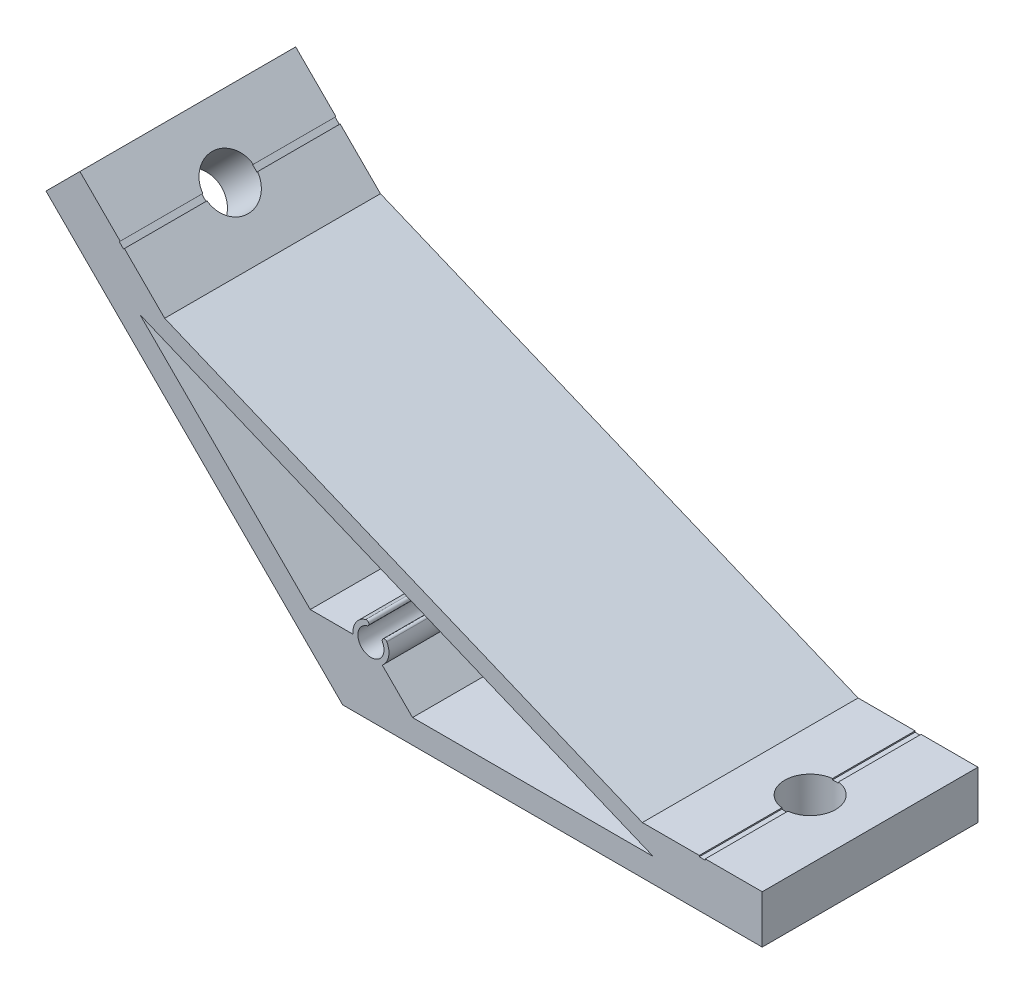
ISO-10303-21;
HEADER;
FILE_DESCRIPTION(('STEP AP214'),'2;1');
FILE_NAME('part.step','',(''),(''),'','','');
FILE_SCHEMA(('AUTOMOTIVE_DESIGN { 1 0 10303 214 1 1 1 1 }'));
ENDSEC;
DATA;
#1=APPLICATION_CONTEXT('core data for automotive mechanical design processes');
#2=APPLICATION_PROTOCOL_DEFINITION('international standard','automotive_design',2000,#1);
#3=PRODUCT_CONTEXT('',#1,'mechanical');
#4=PRODUCT('Part','Part','',(#3));
#5=PRODUCT_RELATED_PRODUCT_CATEGORY('part','',(#4));
#6=PRODUCT_DEFINITION_FORMATION('','',#4);
#7=PRODUCT_DEFINITION_CONTEXT('part definition',#1,'design');
#8=PRODUCT_DEFINITION('design','',#6,#7);
#9=PRODUCT_DEFINITION_SHAPE('','',#8);
#10=(LENGTH_UNIT() NAMED_UNIT(*) SI_UNIT(.MILLI.,.METRE.));
#11=(NAMED_UNIT(*) PLANE_ANGLE_UNIT() SI_UNIT($,.RADIAN.));
#12=(NAMED_UNIT(*) SI_UNIT($,.STERADIAN.) SOLID_ANGLE_UNIT());
#13=UNCERTAINTY_MEASURE_WITH_UNIT(LENGTH_MEASURE(1.E-05),#10,'distance_accuracy_value','');
#14=(GEOMETRIC_REPRESENTATION_CONTEXT(3) GLOBAL_UNCERTAINTY_ASSIGNED_CONTEXT((#13)) GLOBAL_UNIT_ASSIGNED_CONTEXT((#10,
#11,#12)) REPRESENTATION_CONTEXT('',''));
#15=CARTESIAN_POINT('',(0.,0.,0.));
#16=DIRECTION('',(0.,0.,1.));
#17=DIRECTION('',(1.,0.,0.));
#18=AXIS2_PLACEMENT_3D('',#15,#16,#17);
#19=CARTESIAN_POINT('',(-43.8406204335662,55.1543289325505,36.));
#20=DIRECTION('',(-0.707106781186544,-0.707106781186551,0.));
#21=DIRECTION('',(0.707106781186551,-0.707106781186544,0.));
#22=AXIS2_PLACEMENT_3D('',#19,#20,#21);
#23=PLANE('',#22);
#24=DIRECTION('',(-0.707106781186551,0.707106781186544,0.));
#25=VECTOR('',#24,1.);
#26=CARTESIAN_POINT('',(-43.8406204335662,55.1543289325505,36.));
#27=LINE('',#26,#25);
#28=CARTESIAN_POINT('',(-37.123106012294,48.4368145112783,36.));
#29=VERTEX_POINT('',#28);
#30=CARTESIAN_POINT('',(-43.8406204335662,55.1543289325505,36.));
#31=VERTEX_POINT('',#30);
#32=EDGE_CURVE('E406',#29,#31,#27,.T.);
#33=ORIENTED_EDGE('',*,*,#32,.F.);
#34=DIRECTION('',(0.,0.,1.));
#35=VECTOR('',#34,1.);
#36=CARTESIAN_POINT('',(-37.123106012294,48.4368145112783,36.));
#37=LINE('',#36,#35);
#38=CARTESIAN_POINT('',(-37.123106012294,48.4368145112783,22.2204857540335));
#39=VERTEX_POINT('',#38);
#40=EDGE_CURVE('E488',#39,#29,#37,.T.);
#41=ORIENTED_EDGE('',*,*,#40,.F.);
#42=CARTESIAN_POINT('',(-36.7695526217007,48.083261120685,18.));
#43=DIRECTION('',(-0.707106781186544,-0.707106781186551,0.));
#44=DIRECTION('',(0.707106781186551,-0.707106781186544,0.));
#45=AXIS2_PLACEMENT_3D('',#42,#43,#44);
#46=CIRCLE('',#45,4.25);
#47=CARTESIAN_POINT('',(-37.123106012294,48.4368145112783,13.7795142459665));
#48=VERTEX_POINT('',#47);
#49=EDGE_CURVE('E451',#48,#39,#46,.F.);
#50=ORIENTED_EDGE('',*,*,#49,.F.);
#51=CARTESIAN_POINT('',(-37.123106012294,48.4368145112783,0.));
#52=VERTEX_POINT('',#51);
#53=EDGE_CURVE('E264',#52,#48,#37,.T.);
#54=ORIENTED_EDGE('',*,*,#53,.F.);
#55=DIRECTION('',(-0.707106781186551,0.707106781186544,0.));
#56=VECTOR('',#55,1.);
#57=CARTESIAN_POINT('',(-43.8406204335662,55.1543289325505,0.));
#58=LINE('',#57,#56);
#59=CARTESIAN_POINT('',(-43.8406204335662,55.1543289325505,0.));
#60=VERTEX_POINT('',#59);
#61=EDGE_CURVE('E423',#52,#60,#58,.T.);
#62=ORIENTED_EDGE('',*,*,#61,.T.);
#63=DIRECTION('',(0.,0.,-1.));
#64=VECTOR('',#63,1.);
#65=CARTESIAN_POINT('',(-43.8406204335662,55.1543289325505,36.));
#66=LINE('',#65,#64);
#67=EDGE_CURVE('E430',#31,#60,#66,.T.);
#68=ORIENTED_EDGE('',*,*,#67,.F.);
#69=EDGE_LOOP('',(#33,#41,#50,#54,#62,#68));
#70=FACE_BOUND('',#69,.T.);
#71=ADVANCED_FACE('F35',(#70),#23,.F.);
#72=CARTESIAN_POINT('',(50.,8.,36.));
#73=DIRECTION('',(0.,-1.,0.));
#74=DIRECTION('',(0.,0.,-1.));
#75=AXIS2_PLACEMENT_3D('',#72,#73,#74);
#76=PLANE('',#75);
#77=DIRECTION('',(-1.,0.,0.));
#78=VECTOR('',#77,1.);
#79=CARTESIAN_POINT('',(50.,8.,36.));
#80=LINE('',#79,#78);
#81=CARTESIAN_POINT('',(59.5,8.,36.));
#82=VERTEX_POINT('',#81);
#83=CARTESIAN_POINT('',(50.,8.,36.));
#84=VERTEX_POINT('',#83);
#85=EDGE_CURVE('E400',#82,#84,#80,.T.);
#86=ORIENTED_EDGE('',*,*,#85,.F.);
#87=DIRECTION('',(0.,0.,1.));
#88=VECTOR('',#87,1.);
#89=CARTESIAN_POINT('',(59.5,8.,36.));
#90=LINE('',#89,#88);
#91=CARTESIAN_POINT('',(59.5,8.,22.2204857540335));
#92=VERTEX_POINT('',#91);
#93=EDGE_CURVE('E295',#92,#82,#90,.T.);
#94=ORIENTED_EDGE('',*,*,#93,.F.);
#95=CARTESIAN_POINT('',(60.,8.,18.));
#96=DIRECTION('',(0.,1.,0.));
#97=DIRECTION('',(0.,0.,1.));
#98=AXIS2_PLACEMENT_3D('',#95,#96,#97);
#99=CIRCLE('',#98,4.25000000000001);
#100=CARTESIAN_POINT('',(59.5,8.,13.7795142459665));
#101=VERTEX_POINT('',#100);
#102=EDGE_CURVE('E315',#101,#92,#99,.T.);
#103=ORIENTED_EDGE('',*,*,#102,.F.);
#104=CARTESIAN_POINT('',(59.5,8.,0.));
#105=VERTEX_POINT('',#104);
#106=EDGE_CURVE('E292',#105,#101,#90,.T.);
#107=ORIENTED_EDGE('',*,*,#106,.F.);
#108=DIRECTION('',(-1.,0.,0.));
#109=VECTOR('',#108,1.);
#110=CARTESIAN_POINT('',(50.,8.,0.));
#111=LINE('',#110,#109);
#112=CARTESIAN_POINT('',(50.,8.,0.));
#113=VERTEX_POINT('',#112);
#114=EDGE_CURVE('E417',#105,#113,#111,.T.);
#115=ORIENTED_EDGE('',*,*,#114,.T.);
#116=DIRECTION('',(0.,0.,-1.));
#117=VECTOR('',#116,1.);
#118=CARTESIAN_POINT('',(50.,8.,36.));
#119=LINE('',#118,#117);
#120=EDGE_CURVE('E436',#84,#113,#119,.T.);
#121=ORIENTED_EDGE('',*,*,#120,.F.);
#122=EDGE_LOOP('',(#86,#94,#103,#107,#115,#121));
#123=FACE_BOUND('',#122,.T.);
#124=ADVANCED_FACE('F526',(#123),#76,.F.);
#125=CARTESIAN_POINT('',(0.,0.,36.));
#126=DIRECTION('',(0.,0.,-1.));
#127=DIRECTION('',(-1.,0.,0.));
#128=AXIS2_PLACEMENT_3D('',#125,#126,#127);
#129=PLANE('',#128);
#130=DIRECTION('',(0.707106781186551,-0.707106781186544,0.));
#131=VECTOR('',#130,1.);
#132=CARTESIAN_POINT('',(-37.2645273685313,48.295393155041,36.));
#133=LINE('',#132,#131);
#134=CARTESIAN_POINT('',(-37.2645273685313,48.295393155041,36.));
#135=VERTEX_POINT('',#134);
#136=CARTESIAN_POINT('',(-36.5574205873448,47.5882863738545,36.));
#137=VERTEX_POINT('',#136);
#138=EDGE_CURVE('E257',#135,#137,#133,.T.);
#139=ORIENTED_EDGE('',*,*,#138,.F.);
#140=DIRECTION('',(0.707106781186544,0.707106781186551,0.));
#141=VECTOR('',#140,1.);
#142=CARTESIAN_POINT('',(-37.2645273685313,48.295393155041,36.));
#143=LINE('',#142,#141);
#144=EDGE_CURVE('E483',#135,#29,#143,.T.);
#145=ORIENTED_EDGE('',*,*,#144,.T.);
#146=ORIENTED_EDGE('',*,*,#32,.T.);
#147=DIRECTION('',(-0.707106781186544,-0.707106781186551,0.));
#148=VECTOR('',#147,1.);
#149=CARTESIAN_POINT('',(-49.4974746830586,49.4974746830581,36.));
#150=LINE('',#149,#148);
#151=CARTESIAN_POINT('',(-49.4974746830586,49.4974746830581,36.));
#152=VERTEX_POINT('',#151);
#153=EDGE_CURVE('E408',#31,#152,#150,.T.);
#154=ORIENTED_EDGE('',*,*,#153,.T.);
#155=DIRECTION('',(0.707106781186551,-0.707106781186544,0.));
#156=VECTOR('',#155,1.);
#157=CARTESIAN_POINT('',(0.,0.,36.));
#158=LINE('',#157,#156);
#159=CARTESIAN_POINT('',(0.,0.,36.));
#160=VERTEX_POINT('',#159);
#161=EDGE_CURVE('E392',#152,#160,#158,.T.);
#162=ORIENTED_EDGE('',*,*,#161,.T.);
#163=DIRECTION('',(1.,0.,0.));
#164=VECTOR('',#163,1.);
#165=CARTESIAN_POINT('',(0.,0.,36.));
#166=LINE('',#165,#164);
#167=CARTESIAN_POINT('',(70.,0.,36.));
#168=VERTEX_POINT('',#167);
#169=EDGE_CURVE('E395',#160,#168,#166,.T.);
#170=ORIENTED_EDGE('',*,*,#169,.T.);
#171=DIRECTION('',(0.,1.,0.));
#172=VECTOR('',#171,1.);
#173=CARTESIAN_POINT('',(70.,8.,36.));
#174=LINE('',#173,#172);
#175=CARTESIAN_POINT('',(70.,8.,36.));
#176=VERTEX_POINT('',#175);
#177=EDGE_CURVE('E398',#168,#176,#174,.T.);
#178=ORIENTED_EDGE('',*,*,#177,.T.);
#179=CARTESIAN_POINT('',(60.5,8.,36.));
#180=VERTEX_POINT('',#179);
#181=EDGE_CURVE('E401',#176,#180,#80,.T.);
#182=ORIENTED_EDGE('',*,*,#181,.T.);
#183=DIRECTION('',(0.,1.,0.));
#184=VECTOR('',#183,1.);
#185=CARTESIAN_POINT('',(60.5,7.8,36.));
#186=LINE('',#185,#184);
#187=CARTESIAN_POINT('',(60.5,7.8,36.));
#188=VERTEX_POINT('',#187);
#189=EDGE_CURVE('E304',#188,#180,#186,.T.);
#190=ORIENTED_EDGE('',*,*,#189,.F.);
#191=DIRECTION('',(1.,0.,0.));
#192=VECTOR('',#191,1.);
#193=CARTESIAN_POINT('',(59.5,7.8,36.));
#194=LINE('',#193,#192);
#195=CARTESIAN_POINT('',(59.5,7.8,36.));
#196=VERTEX_POINT('',#195);
#197=EDGE_CURVE('E281',#196,#188,#194,.T.);
#198=ORIENTED_EDGE('',*,*,#197,.F.);
#199=DIRECTION('',(0.,1.,0.));
#200=VECTOR('',#199,1.);
#201=CARTESIAN_POINT('',(59.5,7.8,36.));
#202=LINE('',#201,#200);
#203=EDGE_CURVE('E291',#196,#82,#202,.T.);
#204=ORIENTED_EDGE('',*,*,#203,.T.);
#205=ORIENTED_EDGE('',*,*,#85,.T.);
#206=DIRECTION('',(-0.923879532511288,0.382683432365087,0.));
#207=VECTOR('',#206,1.);
#208=CARTESIAN_POINT('',(-29.6984848098352,41.0121933088196,36.));
#209=LINE('',#208,#207);
#210=CARTESIAN_POINT('',(-29.6984848098352,41.0121933088196,36.));
#211=VERTEX_POINT('',#210);
#212=EDGE_CURVE('E404',#84,#211,#209,.T.);
#213=ORIENTED_EDGE('',*,*,#212,.T.);
#214=CARTESIAN_POINT('',(-36.4159992311074,47.7297077300918,36.));
#215=VERTEX_POINT('',#214);
#216=EDGE_CURVE('E270',#211,#215,#27,.T.);
#217=ORIENTED_EDGE('',*,*,#216,.T.);
#218=DIRECTION('',(0.707106781186544,0.707106781186551,0.));
#219=VECTOR('',#218,1.);
#220=CARTESIAN_POINT('',(-36.5574205873448,47.5882863738545,36.));
#221=LINE('',#220,#219);
#222=EDGE_CURVE('E249',#137,#215,#221,.T.);
#223=ORIENTED_EDGE('',*,*,#222,.F.);
#224=EDGE_LOOP('',(#139,#145,#146,#154,#162,#170,#178,#182,#190,#198,#204,#205,#213,#217,#223));
#225=FACE_BOUND('',#224,.T.);
#226=DIRECTION('',(1.,0.,0.));
#227=VECTOR('',#226,1.);
#228=CARTESIAN_POINT('',(-5.41421356237323,11.0710678118655,36.));
#229=LINE('',#228,#227);
#230=CARTESIAN_POINT('',(-5.41421356237323,11.0710678118655,36.));
#231=VERTEX_POINT('',#230);
#232=CARTESIAN_POINT('',(1.73543381374779,11.0710678118655,36.));
#233=VERTEX_POINT('',#232);
#234=EDGE_CURVE('E319',#231,#233,#229,.T.);
#235=ORIENTED_EDGE('',*,*,#234,.F.);
#236=DIRECTION('',(0.707106781186551,-0.707106781186544,0.));
#237=VECTOR('',#236,1.);
#238=CARTESIAN_POINT('',(-33.8120618642599,39.4689161137519,36.));
#239=LINE('',#238,#237);
#240=CARTESIAN_POINT('',(-33.8120618642599,39.4689161137519,36.));
#241=VERTEX_POINT('',#240);
#242=EDGE_CURVE('E339',#241,#231,#239,.T.);
#243=ORIENTED_EDGE('',*,*,#242,.F.);
#244=DIRECTION('',(-0.923879532511288,0.382683432365087,0.));
#245=VECTOR('',#244,1.);
#246=CARTESIAN_POINT('',(51.8174764602341,4.,36.));
#247=LINE('',#246,#245);
#248=CARTESIAN_POINT('',(51.8174764602341,4.,36.));
#249=VERTEX_POINT('',#248);
#250=EDGE_CURVE('E336',#249,#241,#247,.T.);
#251=ORIENTED_EDGE('',*,*,#250,.F.);
#252=DIRECTION('',(1.,0.,0.));
#253=VECTOR('',#252,1.);
#254=CARTESIAN_POINT('',(11.6568542494925,4.,36.));
#255=LINE('',#254,#253);
#256=CARTESIAN_POINT('',(11.6568542494925,4.,36.));
#257=VERTEX_POINT('',#256);
#258=EDGE_CURVE('E334',#257,#249,#255,.T.);
#259=ORIENTED_EDGE('',*,*,#258,.F.);
#260=DIRECTION('',(0.707106781186546,-0.707106781186549,0.));
#261=VECTOR('',#260,1.);
#262=CARTESIAN_POINT('',(6.6012901067447,9.05556414274779,36.));
#263=LINE('',#262,#261);
#264=CARTESIAN_POINT('',(6.6012901067447,9.05556414274779,36.));
#265=VERTEX_POINT('',#264);
#266=EDGE_CURVE('E332',#265,#257,#263,.T.);
#267=ORIENTED_EDGE('',*,*,#266,.F.);
#268=CARTESIAN_POINT('',(4.71832170841306,11.3910362600903,36.));
#269=DIRECTION('',(0.,0.,-1.));
#270=DIRECTION('',(1.,0.,0.));
#271=AXIS2_PLACEMENT_3D('',#268,#269,#270);
#272=CIRCLE('',#271,3.);
#273=CARTESIAN_POINT('',(7.3658868906872,12.8018511329952,36.));
#274=VERTEX_POINT('',#273);
#275=EDGE_CURVE('E330',#274,#265,#272,.T.);
#276=ORIENTED_EDGE('',*,*,#275,.F.);
#277=CARTESIAN_POINT('',(7.00405298244307,12.6090397670315,36.));
#278=DIRECTION('',(0.,0.,-1.));
#279=DIRECTION('',(1.,0.,0.));
#280=AXIS2_PLACEMENT_3D('',#277,#278,#279);
#281=CIRCLE('',#280,0.410000000000001);
#282=CARTESIAN_POINT('',(6.64221907419893,12.4162284010679,36.));
#283=VERTEX_POINT('',#282);
#284=EDGE_CURVE('E328',#283,#274,#281,.T.);
#285=ORIENTED_EDGE('',*,*,#284,.F.);
#286=CARTESIAN_POINT('',(4.71832170841306,11.3910362600903,36.));
#287=DIRECTION('',(0.,0.,1.));
#288=DIRECTION('',(1.,0.,0.));
#289=AXIS2_PLACEMENT_3D('',#286,#287,#288);
#290=CIRCLE('',#289,2.18);
#291=CARTESIAN_POINT('',(4.08284114966332,13.4763574486488,36.));
#292=VERTEX_POINT('',#291);
#293=EDGE_CURVE('E326',#292,#283,#290,.T.);
#294=ORIENTED_EDGE('',*,*,#293,.F.);
#295=CARTESIAN_POINT('',(3.96332416384342,13.8685508831942,36.));
#296=DIRECTION('',(0.,0.,-1.));
#297=DIRECTION('',(1.,0.,0.));
#298=AXIS2_PLACEMENT_3D('',#295,#296,#297);
#299=CIRCLE('',#298,0.410000000000001);
#300=CARTESIAN_POINT('',(3.84380717802351,14.2607443177396,36.));
#301=VERTEX_POINT('',#300);
#302=EDGE_CURVE('E324',#301,#292,#299,.T.);
#303=ORIENTED_EDGE('',*,*,#302,.F.);
#304=CARTESIAN_POINT('',(4.71832170841306,11.3910362600903,36.));
#305=DIRECTION('',(0.,0.,-1.));
#306=DIRECTION('',(1.,0.,0.));
#307=AXIS2_PLACEMENT_3D('',#304,#305,#306);
#308=CIRCLE('',#307,3.);
#309=EDGE_CURVE('E321',#233,#301,#308,.T.);
#310=ORIENTED_EDGE('',*,*,#309,.F.);
#311=EDGE_LOOP('',(#235,#243,#251,#259,#267,#276,#285,#294,#303,#310));
#312=FACE_BOUND('',#311,.T.);
#313=ADVANCED_FACE('F267',(#225,#312),#129,.F.);
#314=CARTESIAN_POINT('',(0.,0.,0.));
#315=DIRECTION('',(0.,0.,-1.));
#316=DIRECTION('',(-1.,0.,0.));
#317=AXIS2_PLACEMENT_3D('',#314,#315,#316);
#318=PLANE('',#317);
#319=DIRECTION('',(0.707106781186544,0.707106781186551,0.));
#320=VECTOR('',#319,1.);
#321=CARTESIAN_POINT('',(-37.2645273685313,48.295393155041,0.));
#322=LINE('',#321,#320);
#323=CARTESIAN_POINT('',(-37.2645273685313,48.295393155041,0.));
#324=VERTEX_POINT('',#323);
#325=EDGE_CURVE('E274',#324,#52,#322,.T.);
#326=ORIENTED_EDGE('',*,*,#325,.F.);
#327=DIRECTION('',(-0.707106781186551,0.707106781186544,0.));
#328=VECTOR('',#327,1.);
#329=CARTESIAN_POINT('',(-37.2645273685313,48.295393155041,0.));
#330=LINE('',#329,#328);
#331=CARTESIAN_POINT('',(-36.5574205873448,47.5882863738545,0.));
#332=VERTEX_POINT('',#331);
#333=EDGE_CURVE('E253',#332,#324,#330,.T.);
#334=ORIENTED_EDGE('',*,*,#333,.F.);
#335=DIRECTION('',(0.707106781186544,0.707106781186551,0.));
#336=VECTOR('',#335,1.);
#337=CARTESIAN_POINT('',(-36.5574205873448,47.5882863738545,0.));
#338=LINE('',#337,#336);
#339=CARTESIAN_POINT('',(-36.4159992311074,47.7297077300918,0.));
#340=VERTEX_POINT('',#339);
#341=EDGE_CURVE('E271',#332,#340,#338,.T.);
#342=ORIENTED_EDGE('',*,*,#341,.T.);
#343=CARTESIAN_POINT('',(-29.6984848098352,41.0121933088196,0.));
#344=VERTEX_POINT('',#343);
#345=EDGE_CURVE('E424',#344,#340,#58,.T.);
#346=ORIENTED_EDGE('',*,*,#345,.F.);
#347=DIRECTION('',(-0.923879532511288,0.382683432365087,0.));
#348=VECTOR('',#347,1.);
#349=CARTESIAN_POINT('',(-29.6984848098352,41.0121933088196,0.));
#350=LINE('',#349,#348);
#351=EDGE_CURVE('E421',#113,#344,#350,.T.);
#352=ORIENTED_EDGE('',*,*,#351,.F.);
#353=ORIENTED_EDGE('',*,*,#114,.F.);
#354=DIRECTION('',(0.,1.,0.));
#355=VECTOR('',#354,1.);
#356=CARTESIAN_POINT('',(59.5,7.8,0.));
#357=LINE('',#356,#355);
#358=CARTESIAN_POINT('',(59.5,7.8,0.));
#359=VERTEX_POINT('',#358);
#360=EDGE_CURVE('E298',#359,#105,#357,.T.);
#361=ORIENTED_EDGE('',*,*,#360,.F.);
#362=DIRECTION('',(-1.,0.,0.));
#363=VECTOR('',#362,1.);
#364=CARTESIAN_POINT('',(59.5,7.8,0.));
#365=LINE('',#364,#363);
#366=CARTESIAN_POINT('',(60.5,7.8,0.));
#367=VERTEX_POINT('',#366);
#368=EDGE_CURVE('E288',#367,#359,#365,.T.);
#369=ORIENTED_EDGE('',*,*,#368,.F.);
#370=DIRECTION('',(0.,1.,0.));
#371=VECTOR('',#370,1.);
#372=CARTESIAN_POINT('',(60.5,7.8,0.));
#373=LINE('',#372,#371);
#374=CARTESIAN_POINT('',(60.5,8.,0.));
#375=VERTEX_POINT('',#374);
#376=EDGE_CURVE('E301',#367,#375,#373,.T.);
#377=ORIENTED_EDGE('',*,*,#376,.T.);
#378=CARTESIAN_POINT('',(70.,8.,0.));
#379=VERTEX_POINT('',#378);
#380=EDGE_CURVE('E418',#379,#375,#111,.T.);
#381=ORIENTED_EDGE('',*,*,#380,.F.);
#382=DIRECTION('',(0.,1.,0.));
#383=VECTOR('',#382,1.);
#384=CARTESIAN_POINT('',(70.,8.,0.));
#385=LINE('',#384,#383);
#386=CARTESIAN_POINT('',(70.,0.,0.));
#387=VERTEX_POINT('',#386);
#388=EDGE_CURVE('E415',#387,#379,#385,.T.);
#389=ORIENTED_EDGE('',*,*,#388,.F.);
#390=DIRECTION('',(1.,0.,0.));
#391=VECTOR('',#390,1.);
#392=CARTESIAN_POINT('',(0.,0.,0.));
#393=LINE('',#392,#391);
#394=CARTESIAN_POINT('',(0.,0.,0.));
#395=VERTEX_POINT('',#394);
#396=EDGE_CURVE('E413',#395,#387,#393,.T.);
#397=ORIENTED_EDGE('',*,*,#396,.F.);
#398=DIRECTION('',(0.707106781186551,-0.707106781186544,0.));
#399=VECTOR('',#398,1.);
#400=CARTESIAN_POINT('',(0.,0.,0.));
#401=LINE('',#400,#399);
#402=CARTESIAN_POINT('',(-49.4974746830586,49.4974746830581,0.));
#403=VERTEX_POINT('',#402);
#404=EDGE_CURVE('E391',#403,#395,#401,.T.);
#405=ORIENTED_EDGE('',*,*,#404,.F.);
#406=DIRECTION('',(-0.707106781186544,-0.707106781186551,0.));
#407=VECTOR('',#406,1.);
#408=CARTESIAN_POINT('',(-49.4974746830586,49.4974746830581,0.));
#409=LINE('',#408,#407);
#410=EDGE_CURVE('E396',#60,#403,#409,.T.);
#411=ORIENTED_EDGE('',*,*,#410,.F.);
#412=ORIENTED_EDGE('',*,*,#61,.F.);
#413=EDGE_LOOP('',(#326,#334,#342,#346,#352,#353,#361,#369,#377,#381,#389,#397,#405,#411,#412));
#414=FACE_BOUND('',#413,.T.);
#415=DIRECTION('',(0.707106781186551,-0.707106781186544,0.));
#416=VECTOR('',#415,1.);
#417=CARTESIAN_POINT('',(-33.8120618642599,39.4689161137519,0.));
#418=LINE('',#417,#416);
#419=CARTESIAN_POINT('',(-33.8120618642599,39.4689161137519,0.));
#420=VERTEX_POINT('',#419);
#421=CARTESIAN_POINT('',(-5.41421356237323,11.0710678118655,0.));
#422=VERTEX_POINT('',#421);
#423=EDGE_CURVE('E322',#420,#422,#418,.T.);
#424=ORIENTED_EDGE('',*,*,#423,.T.);
#425=DIRECTION('',(1.,0.,0.));
#426=VECTOR('',#425,1.);
#427=CARTESIAN_POINT('',(-5.41421356237323,11.0710678118655,0.));
#428=LINE('',#427,#426);
#429=CARTESIAN_POINT('',(1.73543381374779,11.0710678118655,0.));
#430=VERTEX_POINT('',#429);
#431=EDGE_CURVE('E318',#422,#430,#428,.T.);
#432=ORIENTED_EDGE('',*,*,#431,.T.);
#433=CARTESIAN_POINT('',(4.71832170841306,11.3910362600903,0.));
#434=DIRECTION('',(0.,0.,-1.));
#435=DIRECTION('',(1.,0.,0.));
#436=AXIS2_PLACEMENT_3D('',#433,#434,#435);
#437=CIRCLE('',#436,3.);
#438=CARTESIAN_POINT('',(3.84380717802351,14.2607443177396,0.));
#439=VERTEX_POINT('',#438);
#440=EDGE_CURVE('E344',#430,#439,#437,.T.);
#441=ORIENTED_EDGE('',*,*,#440,.T.);
#442=CARTESIAN_POINT('',(3.96332416384342,13.8685508831942,0.));
#443=DIRECTION('',(0.,0.,-1.));
#444=DIRECTION('',(1.,0.,0.));
#445=AXIS2_PLACEMENT_3D('',#442,#443,#444);
#446=CIRCLE('',#445,0.410000000000001);
#447=CARTESIAN_POINT('',(4.08284114966332,13.4763574486488,0.));
#448=VERTEX_POINT('',#447);
#449=EDGE_CURVE('E347',#439,#448,#446,.T.);
#450=ORIENTED_EDGE('',*,*,#449,.T.);
#451=CARTESIAN_POINT('',(4.71832170841306,11.3910362600903,0.));
#452=DIRECTION('',(0.,0.,1.));
#453=DIRECTION('',(1.,0.,0.));
#454=AXIS2_PLACEMENT_3D('',#451,#452,#453);
#455=CIRCLE('',#454,2.18);
#456=CARTESIAN_POINT('',(6.64221907419893,12.4162284010679,0.));
#457=VERTEX_POINT('',#456);
#458=EDGE_CURVE('E350',#448,#457,#455,.T.);
#459=ORIENTED_EDGE('',*,*,#458,.T.);
#460=CARTESIAN_POINT('',(7.00405298244307,12.6090397670315,0.));
#461=DIRECTION('',(0.,0.,-1.));
#462=DIRECTION('',(1.,0.,0.));
#463=AXIS2_PLACEMENT_3D('',#460,#461,#462);
#464=CIRCLE('',#463,0.410000000000001);
#465=CARTESIAN_POINT('',(7.3658868906872,12.8018511329952,0.));
#466=VERTEX_POINT('',#465);
#467=EDGE_CURVE('E353',#457,#466,#464,.T.);
#468=ORIENTED_EDGE('',*,*,#467,.T.);
#469=CARTESIAN_POINT('',(4.71832170841306,11.3910362600903,0.));
#470=DIRECTION('',(0.,0.,-1.));
#471=DIRECTION('',(1.,0.,0.));
#472=AXIS2_PLACEMENT_3D('',#469,#470,#471);
#473=CIRCLE('',#472,3.);
#474=CARTESIAN_POINT('',(6.6012901067447,9.05556414274779,0.));
#475=VERTEX_POINT('',#474);
#476=EDGE_CURVE('E356',#466,#475,#473,.T.);
#477=ORIENTED_EDGE('',*,*,#476,.T.);
#478=DIRECTION('',(0.707106781186546,-0.707106781186549,0.));
#479=VECTOR('',#478,1.);
#480=CARTESIAN_POINT('',(6.6012901067447,9.05556414274779,0.));
#481=LINE('',#480,#479);
#482=CARTESIAN_POINT('',(11.6568542494925,4.,0.));
#483=VERTEX_POINT('',#482);
#484=EDGE_CURVE('E359',#475,#483,#481,.T.);
#485=ORIENTED_EDGE('',*,*,#484,.T.);
#486=DIRECTION('',(1.,0.,0.));
#487=VECTOR('',#486,1.);
#488=CARTESIAN_POINT('',(11.6568542494925,4.,0.));
#489=LINE('',#488,#487);
#490=CARTESIAN_POINT('',(51.8174764602341,4.,0.));
#491=VERTEX_POINT('',#490);
#492=EDGE_CURVE('E362',#483,#491,#489,.T.);
#493=ORIENTED_EDGE('',*,*,#492,.T.);
#494=DIRECTION('',(-0.923879532511288,0.382683432365087,0.));
#495=VECTOR('',#494,1.);
#496=CARTESIAN_POINT('',(51.8174764602341,4.,0.));
#497=LINE('',#496,#495);
#498=EDGE_CURVE('E365',#491,#420,#497,.T.);
#499=ORIENTED_EDGE('',*,*,#498,.T.);
#500=EDGE_LOOP('',(#424,#432,#441,#450,#459,#468,#477,#485,#493,#499));
#501=FACE_BOUND('',#500,.T.);
#502=ADVANCED_FACE('F504',(#414,#501),#318,.T.);
#503=CARTESIAN_POINT('',(0.,0.,36.));
#504=DIRECTION('',(0.707106781186544,0.707106781186551,0.));
#505=DIRECTION('',(-0.707106781186551,0.707106781186544,0.));
#506=AXIS2_PLACEMENT_3D('',#503,#504,#505);
#507=PLANE('',#506);
#508=CARTESIAN_POINT('',(-42.4264068711931,42.4264068711926,18.));
#509=DIRECTION('',(0.707106781186544,0.707106781186551,0.));
#510=DIRECTION('',(-0.707106781186551,0.707106781186544,0.));
#511=AXIS2_PLACEMENT_3D('',#508,#509,#510);
#512=CIRCLE('',#511,4.25);
#513=CARTESIAN_POINT('',(-45.4316106912359,45.4316106912354,18.));
#514=VERTEX_POINT('',#513);
#515=EDGE_CURVE('E300',#514,#514,#512,.F.);
#516=ORIENTED_EDGE('',*,*,#515,.F.);
#517=EDGE_LOOP('',(#516));
#518=FACE_BOUND('',#517,.T.);
#519=ORIENTED_EDGE('',*,*,#404,.T.);
#520=DIRECTION('',(0.,0.,-1.));
#521=VECTOR('',#520,1.);
#522=CARTESIAN_POINT('',(0.,0.,36.));
#523=LINE('',#522,#521);
#524=EDGE_CURVE('E445',#160,#395,#523,.T.);
#525=ORIENTED_EDGE('',*,*,#524,.F.);
#526=ORIENTED_EDGE('',*,*,#161,.F.);
#527=DIRECTION('',(0.,0.,-1.));
#528=VECTOR('',#527,1.);
#529=CARTESIAN_POINT('',(-49.4974746830586,49.4974746830581,36.));
#530=LINE('',#529,#528);
#531=EDGE_CURVE('E410',#152,#403,#530,.T.);
#532=ORIENTED_EDGE('',*,*,#531,.T.);
#533=EDGE_LOOP('',(#519,#525,#526,#532));
#534=FACE_BOUND('',#533,.T.);
#535=ADVANCED_FACE('F37',(#518,#534),#507,.F.);
#536=CARTESIAN_POINT('',(0.,0.,36.));
#537=DIRECTION('',(0.,1.,0.));
#538=DIRECTION('',(0.,0.,1.));
#539=AXIS2_PLACEMENT_3D('',#536,#537,#538);
#540=PLANE('',#539);
#541=CARTESIAN_POINT('',(60.,0.,18.));
#542=DIRECTION('',(0.,1.,0.));
#543=DIRECTION('',(0.,0.,1.));
#544=AXIS2_PLACEMENT_3D('',#541,#542,#543);
#545=CIRCLE('',#544,4.25000000000001);
#546=CARTESIAN_POINT('',(60.,0.,22.25));
#547=VERTEX_POINT('',#546);
#548=EDGE_CURVE('E314',#547,#547,#545,.F.);
#549=ORIENTED_EDGE('',*,*,#548,.F.);
#550=EDGE_LOOP('',(#549));
#551=FACE_BOUND('',#550,.T.);
#552=ORIENTED_EDGE('',*,*,#396,.T.);
#553=DIRECTION('',(0.,0.,-1.));
#554=VECTOR('',#553,1.);
#555=CARTESIAN_POINT('',(70.,0.,36.));
#556=LINE('',#555,#554);
#557=EDGE_CURVE('E442',#168,#387,#556,.T.);
#558=ORIENTED_EDGE('',*,*,#557,.F.);
#559=ORIENTED_EDGE('',*,*,#169,.F.);
#560=ORIENTED_EDGE('',*,*,#524,.T.);
#561=EDGE_LOOP('',(#552,#558,#559,#560));
#562=FACE_BOUND('',#561,.T.);
#563=ADVANCED_FACE('F726',(#551,#562),#540,.F.);
#564=CARTESIAN_POINT('',(70.,8.,36.));
#565=DIRECTION('',(-1.,0.,0.));
#566=DIRECTION('',(0.,0.,1.));
#567=AXIS2_PLACEMENT_3D('',#564,#565,#566);
#568=PLANE('',#567);
#569=ORIENTED_EDGE('',*,*,#388,.T.);
#570=DIRECTION('',(0.,0.,-1.));
#571=VECTOR('',#570,1.);
#572=CARTESIAN_POINT('',(70.,8.,36.));
#573=LINE('',#572,#571);
#574=EDGE_CURVE('E439',#176,#379,#573,.T.);
#575=ORIENTED_EDGE('',*,*,#574,.F.);
#576=ORIENTED_EDGE('',*,*,#177,.F.);
#577=ORIENTED_EDGE('',*,*,#557,.T.);
#578=EDGE_LOOP('',(#569,#575,#576,#577));
#579=FACE_BOUND('',#578,.T.);
#580=ADVANCED_FACE('F713',(#579),#568,.F.);
#581=ORIENTED_EDGE('',*,*,#380,.T.);
#582=DIRECTION('',(0.,0.,-1.));
#583=VECTOR('',#582,1.);
#584=CARTESIAN_POINT('',(60.5,8.,36.));
#585=LINE('',#584,#583);
#586=CARTESIAN_POINT('',(60.5,8.,13.7795142459665));
#587=VERTEX_POINT('',#586);
#588=EDGE_CURVE('E294',#587,#375,#585,.T.);
#589=ORIENTED_EDGE('',*,*,#588,.F.);
#590=CARTESIAN_POINT('',(60.5,8.,22.2204857540335));
#591=VERTEX_POINT('',#590);
#592=EDGE_CURVE('E311',#591,#587,#99,.T.);
#593=ORIENTED_EDGE('',*,*,#592,.F.);
#594=EDGE_CURVE('E296',#180,#591,#585,.T.);
#595=ORIENTED_EDGE('',*,*,#594,.F.);
#596=ORIENTED_EDGE('',*,*,#181,.F.);
#597=ORIENTED_EDGE('',*,*,#574,.T.);
#598=EDGE_LOOP('',(#581,#589,#593,#595,#596,#597));
#599=FACE_BOUND('',#598,.T.);
#600=ADVANCED_FACE('F543',(#599),#76,.F.);
#601=CARTESIAN_POINT('',(-29.6984848098352,41.0121933088196,36.));
#602=DIRECTION('',(-0.382683432365087,-0.923879532511288,0.));
#603=DIRECTION('',(0.923879532511288,-0.382683432365087,0.));
#604=AXIS2_PLACEMENT_3D('',#601,#602,#603);
#605=PLANE('',#604);
#606=ORIENTED_EDGE('',*,*,#351,.T.);
#607=DIRECTION('',(0.,0.,-1.));
#608=VECTOR('',#607,1.);
#609=CARTESIAN_POINT('',(-29.6984848098352,41.0121933088196,36.));
#610=LINE('',#609,#608);
#611=EDGE_CURVE('E433',#211,#344,#610,.T.);
#612=ORIENTED_EDGE('',*,*,#611,.F.);
#613=ORIENTED_EDGE('',*,*,#212,.F.);
#614=ORIENTED_EDGE('',*,*,#120,.T.);
#615=EDGE_LOOP('',(#606,#612,#613,#614));
#616=FACE_BOUND('',#615,.T.);
#617=ADVANCED_FACE('F576',(#616),#605,.F.);
#618=ORIENTED_EDGE('',*,*,#345,.T.);
#619=DIRECTION('',(0.,0.,-1.));
#620=VECTOR('',#619,1.);
#621=CARTESIAN_POINT('',(-36.4159992311074,47.7297077300918,36.));
#622=LINE('',#621,#620);
#623=CARTESIAN_POINT('',(-36.4159992311074,47.7297077300918,13.7795142459665));
#624=VERTEX_POINT('',#623);
#625=EDGE_CURVE('E489',#624,#340,#622,.T.);
#626=ORIENTED_EDGE('',*,*,#625,.F.);
#627=CARTESIAN_POINT('',(-36.4159992311074,47.7297077300918,22.2204857540335));
#628=VERTEX_POINT('',#627);
#629=EDGE_CURVE('E310',#628,#624,#46,.F.);
#630=ORIENTED_EDGE('',*,*,#629,.F.);
#631=EDGE_CURVE('E486',#215,#628,#622,.T.);
#632=ORIENTED_EDGE('',*,*,#631,.F.);
#633=ORIENTED_EDGE('',*,*,#216,.F.);
#634=ORIENTED_EDGE('',*,*,#611,.T.);
#635=EDGE_LOOP('',(#618,#626,#630,#632,#633,#634));
#636=FACE_BOUND('',#635,.T.);
#637=ADVANCED_FACE('F568',(#636),#23,.F.);
#638=CARTESIAN_POINT('',(-49.4974746830586,49.4974746830581,36.));
#639=DIRECTION('',(0.707106781186551,-0.707106781186544,0.));
#640=DIRECTION('',(0.707106781186544,0.707106781186551,0.));
#641=AXIS2_PLACEMENT_3D('',#638,#639,#640);
#642=PLANE('',#641);
#643=ORIENTED_EDGE('',*,*,#410,.T.);
#644=ORIENTED_EDGE('',*,*,#531,.F.);
#645=ORIENTED_EDGE('',*,*,#153,.F.);
#646=ORIENTED_EDGE('',*,*,#67,.T.);
#647=EDGE_LOOP('',(#643,#644,#645,#646));
#648=FACE_BOUND('',#647,.T.);
#649=ADVANCED_FACE('F509',(#648),#642,.F.);
#650=CARTESIAN_POINT('',(-5.41421356237323,11.0710678118655,36.));
#651=DIRECTION('',(0.,1.,0.));
#652=DIRECTION('',(-1.,0.,0.));
#653=AXIS2_PLACEMENT_3D('',#650,#651,#652);
#654=PLANE('',#653);
#655=ORIENTED_EDGE('',*,*,#431,.F.);
#656=DIRECTION('',(0.,0.,-1.));
#657=VECTOR('',#656,1.);
#658=CARTESIAN_POINT('',(-5.41421356237323,11.0710678118655,36.));
#659=LINE('',#658,#657);
#660=EDGE_CURVE('E341',#231,#422,#659,.T.);
#661=ORIENTED_EDGE('',*,*,#660,.F.);
#662=ORIENTED_EDGE('',*,*,#234,.T.);
#663=DIRECTION('',(0.,0.,-1.));
#664=VECTOR('',#663,1.);
#665=CARTESIAN_POINT('',(1.73543381374779,11.0710678118655,36.));
#666=LINE('',#665,#664);
#667=EDGE_CURVE('E388',#233,#430,#666,.T.);
#668=ORIENTED_EDGE('',*,*,#667,.T.);
#669=EDGE_LOOP('',(#655,#661,#662,#668));
#670=FACE_BOUND('',#669,.T.);
#671=ADVANCED_FACE('F582',(#670),#654,.T.);
#672=CARTESIAN_POINT('',(4.71832170841306,11.3910362600903,36.));
#673=DIRECTION('',(0.,0.,-1.));
#674=DIRECTION('',(-1.,0.,0.));
#675=AXIS2_PLACEMENT_3D('',#672,#673,#674);
#676=CYLINDRICAL_SURFACE('',#675,3.);
#677=ORIENTED_EDGE('',*,*,#440,.F.);
#678=ORIENTED_EDGE('',*,*,#667,.F.);
#679=ORIENTED_EDGE('',*,*,#309,.T.);
#680=DIRECTION('',(0.,0.,-1.));
#681=VECTOR('',#680,1.);
#682=CARTESIAN_POINT('',(3.84380717802351,14.2607443177396,36.));
#683=LINE('',#682,#681);
#684=EDGE_CURVE('E386',#301,#439,#683,.T.);
#685=ORIENTED_EDGE('',*,*,#684,.T.);
#686=EDGE_LOOP('',(#677,#678,#679,#685));
#687=FACE_BOUND('',#686,.T.);
#688=ADVANCED_FACE('F811',(#687),#676,.T.);
#689=CARTESIAN_POINT('',(3.96332416384342,13.8685508831942,36.));
#690=DIRECTION('',(0.,0.,-1.));
#691=DIRECTION('',(-1.,0.,0.));
#692=AXIS2_PLACEMENT_3D('',#689,#690,#691);
#693=CYLINDRICAL_SURFACE('',#692,0.410000000000001);
#694=ORIENTED_EDGE('',*,*,#449,.F.);
#695=ORIENTED_EDGE('',*,*,#684,.F.);
#696=ORIENTED_EDGE('',*,*,#302,.T.);
#697=DIRECTION('',(0.,0.,-1.));
#698=VECTOR('',#697,1.);
#699=CARTESIAN_POINT('',(4.08284114966332,13.4763574486488,36.));
#700=LINE('',#699,#698);
#701=EDGE_CURVE('E384',#292,#448,#700,.T.);
#702=ORIENTED_EDGE('',*,*,#701,.T.);
#703=EDGE_LOOP('',(#694,#695,#696,#702));
#704=FACE_BOUND('',#703,.T.);
#705=ADVANCED_FACE('F801',(#704),#693,.T.);
#706=CARTESIAN_POINT('',(4.71832170841306,11.3910362600903,36.));
#707=DIRECTION('',(0.,0.,-1.));
#708=DIRECTION('',(-1.,0.,0.));
#709=AXIS2_PLACEMENT_3D('',#706,#707,#708);
#710=CYLINDRICAL_SURFACE('',#709,2.18);
#711=ORIENTED_EDGE('',*,*,#458,.F.);
#712=ORIENTED_EDGE('',*,*,#701,.F.);
#713=ORIENTED_EDGE('',*,*,#293,.T.);
#714=DIRECTION('',(0.,0.,-1.));
#715=VECTOR('',#714,1.);
#716=CARTESIAN_POINT('',(6.64221907419893,12.4162284010679,36.));
#717=LINE('',#716,#715);
#718=EDGE_CURVE('E382',#283,#457,#717,.T.);
#719=ORIENTED_EDGE('',*,*,#718,.T.);
#720=EDGE_LOOP('',(#711,#712,#713,#719));
#721=FACE_BOUND('',#720,.T.);
#722=ADVANCED_FACE('F791',(#721),#710,.F.);
#723=CARTESIAN_POINT('',(7.00405298244307,12.6090397670315,36.));
#724=DIRECTION('',(0.,0.,-1.));
#725=DIRECTION('',(-1.,0.,0.));
#726=AXIS2_PLACEMENT_3D('',#723,#724,#725);
#727=CYLINDRICAL_SURFACE('',#726,0.410000000000001);
#728=ORIENTED_EDGE('',*,*,#467,.F.);
#729=ORIENTED_EDGE('',*,*,#718,.F.);
#730=ORIENTED_EDGE('',*,*,#284,.T.);
#731=DIRECTION('',(0.,0.,-1.));
#732=VECTOR('',#731,1.);
#733=CARTESIAN_POINT('',(7.3658868906872,12.8018511329952,36.));
#734=LINE('',#733,#732);
#735=EDGE_CURVE('E380',#274,#466,#734,.T.);
#736=ORIENTED_EDGE('',*,*,#735,.T.);
#737=EDGE_LOOP('',(#728,#729,#730,#736));
#738=FACE_BOUND('',#737,.T.);
#739=ADVANCED_FACE('F781',(#738),#727,.T.);
#740=CARTESIAN_POINT('',(4.71832170841306,11.3910362600903,36.));
#741=DIRECTION('',(0.,0.,-1.));
#742=DIRECTION('',(-1.,0.,0.));
#743=AXIS2_PLACEMENT_3D('',#740,#741,#742);
#744=CYLINDRICAL_SURFACE('',#743,3.);
#745=ORIENTED_EDGE('',*,*,#476,.F.);
#746=ORIENTED_EDGE('',*,*,#735,.F.);
#747=ORIENTED_EDGE('',*,*,#275,.T.);
#748=DIRECTION('',(0.,0.,-1.));
#749=VECTOR('',#748,1.);
#750=CARTESIAN_POINT('',(6.6012901067447,9.05556414274779,36.));
#751=LINE('',#750,#749);
#752=EDGE_CURVE('E378',#265,#475,#751,.T.);
#753=ORIENTED_EDGE('',*,*,#752,.T.);
#754=EDGE_LOOP('',(#745,#746,#747,#753));
#755=FACE_BOUND('',#754,.T.);
#756=ADVANCED_FACE('F771',(#755),#744,.T.);
#757=CARTESIAN_POINT('',(6.6012901067447,9.05556414274779,36.));
#758=DIRECTION('',(0.707106781186549,0.707106781186546,0.));
#759=DIRECTION('',(-0.707106781186546,0.707106781186549,0.));
#760=AXIS2_PLACEMENT_3D('',#757,#758,#759);
#761=PLANE('',#760);
#762=ORIENTED_EDGE('',*,*,#484,.F.);
#763=ORIENTED_EDGE('',*,*,#752,.F.);
#764=ORIENTED_EDGE('',*,*,#266,.T.);
#765=DIRECTION('',(0.,0.,-1.));
#766=VECTOR('',#765,1.);
#767=CARTESIAN_POINT('',(11.6568542494925,4.,36.));
#768=LINE('',#767,#766);
#769=EDGE_CURVE('E376',#257,#483,#768,.T.);
#770=ORIENTED_EDGE('',*,*,#769,.T.);
#771=EDGE_LOOP('',(#762,#763,#764,#770));
#772=FACE_BOUND('',#771,.T.);
#773=ADVANCED_FACE('F761',(#772),#761,.T.);
#774=CARTESIAN_POINT('',(11.6568542494925,4.,36.));
#775=DIRECTION('',(0.,1.,0.));
#776=DIRECTION('',(-1.,0.,0.));
#777=AXIS2_PLACEMENT_3D('',#774,#775,#776);
#778=PLANE('',#777);
#779=ORIENTED_EDGE('',*,*,#492,.F.);
#780=ORIENTED_EDGE('',*,*,#769,.F.);
#781=ORIENTED_EDGE('',*,*,#258,.T.);
#782=DIRECTION('',(0.,0.,-1.));
#783=VECTOR('',#782,1.);
#784=CARTESIAN_POINT('',(51.8174764602341,4.,36.));
#785=LINE('',#784,#783);
#786=EDGE_CURVE('E374',#249,#491,#785,.T.);
#787=ORIENTED_EDGE('',*,*,#786,.T.);
#788=EDGE_LOOP('',(#779,#780,#781,#787));
#789=FACE_BOUND('',#788,.T.);
#790=ADVANCED_FACE('F751',(#789),#778,.T.);
#791=CARTESIAN_POINT('',(51.8174764602341,4.,36.));
#792=DIRECTION('',(-0.382683432365087,-0.923879532511288,0.));
#793=DIRECTION('',(0.923879532511288,-0.382683432365087,0.));
#794=AXIS2_PLACEMENT_3D('',#791,#792,#793);
#795=PLANE('',#794);
#796=ORIENTED_EDGE('',*,*,#498,.F.);
#797=ORIENTED_EDGE('',*,*,#786,.F.);
#798=ORIENTED_EDGE('',*,*,#250,.T.);
#799=DIRECTION('',(0.,0.,-1.));
#800=VECTOR('',#799,1.);
#801=CARTESIAN_POINT('',(-33.8120618642599,39.4689161137519,36.));
#802=LINE('',#801,#800);
#803=EDGE_CURVE('E372',#241,#420,#802,.T.);
#804=ORIENTED_EDGE('',*,*,#803,.T.);
#805=EDGE_LOOP('',(#796,#797,#798,#804));
#806=FACE_BOUND('',#805,.T.);
#807=ADVANCED_FACE('F741',(#806),#795,.T.);
#808=CARTESIAN_POINT('',(-33.8120618642599,39.4689161137519,36.));
#809=DIRECTION('',(0.707106781186544,0.707106781186551,0.));
#810=DIRECTION('',(-0.707106781186551,0.707106781186544,0.));
#811=AXIS2_PLACEMENT_3D('',#808,#809,#810);
#812=PLANE('',#811);
#813=ORIENTED_EDGE('',*,*,#423,.F.);
#814=ORIENTED_EDGE('',*,*,#803,.F.);
#815=ORIENTED_EDGE('',*,*,#242,.T.);
#816=ORIENTED_EDGE('',*,*,#660,.T.);
#817=EDGE_LOOP('',(#813,#814,#815,#816));
#818=FACE_BOUND('',#817,.T.);
#819=ADVANCED_FACE('F702',(#818),#812,.T.);
#820=CARTESIAN_POINT('',(60.,-0.000999999999999265,18.));
#821=DIRECTION('',(0.,1.,0.));
#822=DIRECTION('',(0.,0.,1.));
#823=AXIS2_PLACEMENT_3D('',#820,#821,#822);
#824=CYLINDRICAL_SURFACE('',#823,4.25000000000001);
#825=ORIENTED_EDGE('',*,*,#102,.T.);
#826=DIRECTION('',(0.,1.,0.));
#827=VECTOR('',#826,1.);
#828=CARTESIAN_POINT('',(59.5,-0.000999999999999265,22.2204857540335));
#829=LINE('',#828,#827);
#830=CARTESIAN_POINT('',(59.5,7.8,22.2204857540335));
#831=VERTEX_POINT('',#830);
#832=EDGE_CURVE('E464',#92,#831,#829,.F.);
#833=ORIENTED_EDGE('',*,*,#832,.T.);
#834=CARTESIAN_POINT('',(60.,7.8,18.));
#835=DIRECTION('',(0.,-1.,0.));
#836=DIRECTION('',(0.,0.,-1.));
#837=AXIS2_PLACEMENT_3D('',#834,#835,#836);
#838=CIRCLE('',#837,4.25000000000001);
#839=CARTESIAN_POINT('',(60.5,7.8,22.2204857540335));
#840=VERTEX_POINT('',#839);
#841=EDGE_CURVE('E455',#831,#840,#838,.F.);
#842=ORIENTED_EDGE('',*,*,#841,.T.);
#843=DIRECTION('',(0.,1.,0.));
#844=VECTOR('',#843,1.);
#845=CARTESIAN_POINT('',(60.5,-0.000999999999999265,22.2204857540335));
#846=LINE('',#845,#844);
#847=EDGE_CURVE('E461',#840,#591,#846,.T.);
#848=ORIENTED_EDGE('',*,*,#847,.T.);
#849=ORIENTED_EDGE('',*,*,#592,.T.);
#850=DIRECTION('',(0.,1.,0.));
#851=VECTOR('',#850,1.);
#852=CARTESIAN_POINT('',(60.5,-0.000999999999999265,13.7795142459665));
#853=LINE('',#852,#851);
#854=CARTESIAN_POINT('',(60.5,7.8,13.7795142459665));
#855=VERTEX_POINT('',#854);
#856=EDGE_CURVE('E454',#587,#855,#853,.F.);
#857=ORIENTED_EDGE('',*,*,#856,.T.);
#858=CARTESIAN_POINT('',(59.5,7.8,13.7795142459665));
#859=VERTEX_POINT('',#858);
#860=EDGE_CURVE('E448',#855,#859,#838,.F.);
#861=ORIENTED_EDGE('',*,*,#860,.T.);
#862=DIRECTION('',(0.,1.,0.));
#863=VECTOR('',#862,1.);
#864=CARTESIAN_POINT('',(59.5,-0.000999999999999265,13.7795142459665));
#865=LINE('',#864,#863);
#866=EDGE_CURVE('E458',#859,#101,#865,.T.);
#867=ORIENTED_EDGE('',*,*,#866,.T.);
#868=EDGE_LOOP('',(#825,#833,#842,#848,#849,#857,#861,#867));
#869=FACE_BOUND('',#868,.T.);
#870=ORIENTED_EDGE('',*,*,#548,.T.);
#871=EDGE_LOOP('',(#870));
#872=FACE_BOUND('',#871,.T.);
#873=ADVANCED_FACE('F518',(#869,#872),#824,.F.);
#874=CARTESIAN_POINT('',(20.1507575950818,105.003571337468,18.));
#875=DIRECTION('',(-0.707106781186544,-0.707106781186551,0.));
#876=DIRECTION('',(0.707106781186551,-0.707106781186544,0.));
#877=AXIS2_PLACEMENT_3D('',#874,#875,#876);
#878=CYLINDRICAL_SURFACE('',#877,4.25);
#879=DIRECTION('',(-0.707106781186544,-0.707106781186551,0.));
#880=VECTOR('',#879,1.);
#881=CARTESIAN_POINT('',(19.7972042044885,105.357124728061,22.2204857540335));
#882=LINE('',#881,#880);
#883=CARTESIAN_POINT('',(-37.2645273685313,48.295393155041,22.2204857540335));
#884=VERTEX_POINT('',#883);
#885=EDGE_CURVE('E11',#884,#39,#882,.F.);
#886=ORIENTED_EDGE('',*,*,#885,.F.);
#887=CARTESIAN_POINT('',(-36.910973977938,47.9418397644477,18.));
#888=DIRECTION('',(0.707106781186544,0.707106781186551,0.));
#889=DIRECTION('',(-0.707106781186551,0.707106781186544,0.));
#890=AXIS2_PLACEMENT_3D('',#887,#888,#889);
#891=CIRCLE('',#890,4.25);
#892=CARTESIAN_POINT('',(-36.5574205873448,47.5882863738544,22.2204857540335));
#893=VERTEX_POINT('',#892);
#894=EDGE_CURVE('E471',#884,#893,#891,.T.);
#895=ORIENTED_EDGE('',*,*,#894,.T.);
#896=DIRECTION('',(-0.707106781186544,-0.707106781186551,0.));
#897=VECTOR('',#896,1.);
#898=CARTESIAN_POINT('',(20.5043109856751,104.650017946875,22.2204857540335));
#899=LINE('',#898,#897);
#900=EDGE_CURVE('E43',#628,#893,#899,.T.);
#901=ORIENTED_EDGE('',*,*,#900,.F.);
#902=ORIENTED_EDGE('',*,*,#629,.T.);
#903=DIRECTION('',(-0.707106781186544,-0.707106781186551,0.));
#904=VECTOR('',#903,1.);
#905=CARTESIAN_POINT('',(20.5043109856751,104.650017946875,13.7795142459665));
#906=LINE('',#905,#904);
#907=CARTESIAN_POINT('',(-36.5574205873448,47.5882863738544,13.7795142459665));
#908=VERTEX_POINT('',#907);
#909=EDGE_CURVE('E470',#908,#624,#906,.F.);
#910=ORIENTED_EDGE('',*,*,#909,.F.);
#911=CARTESIAN_POINT('',(-37.2645273685313,48.295393155041,13.7795142459665));
#912=VERTEX_POINT('',#911);
#913=EDGE_CURVE('E467',#908,#912,#891,.T.);
#914=ORIENTED_EDGE('',*,*,#913,.T.);
#915=DIRECTION('',(-0.707106781186544,-0.707106781186551,0.));
#916=VECTOR('',#915,1.);
#917=CARTESIAN_POINT('',(19.7972042044885,105.357124728061,13.7795142459665));
#918=LINE('',#917,#916);
#919=EDGE_CURVE('E473',#48,#912,#918,.T.);
#920=ORIENTED_EDGE('',*,*,#919,.F.);
#921=ORIENTED_EDGE('',*,*,#49,.T.);
#922=EDGE_LOOP('',(#886,#895,#901,#902,#910,#914,#920,#921));
#923=FACE_BOUND('',#922,.T.);
#924=ORIENTED_EDGE('',*,*,#515,.T.);
#925=EDGE_LOOP('',(#924));
#926=FACE_BOUND('',#925,.T.);
#927=ADVANCED_FACE('F476',(#923,#926),#878,.F.);
#928=CARTESIAN_POINT('',(0.,7.8,0.));
#929=DIRECTION('',(0.,-1.,0.));
#930=DIRECTION('',(0.,0.,-1.));
#931=AXIS2_PLACEMENT_3D('',#928,#929,#930);
#932=PLANE('',#931);
#933=DIRECTION('',(0.,0.,-1.));
#934=VECTOR('',#933,1.);
#935=CARTESIAN_POINT('',(60.5,7.8,36.));
#936=LINE('',#935,#934);
#937=EDGE_CURVE('E285',#855,#367,#936,.T.);
#938=ORIENTED_EDGE('',*,*,#937,.T.);
#939=ORIENTED_EDGE('',*,*,#368,.T.);
#940=DIRECTION('',(0.,0.,1.));
#941=VECTOR('',#940,1.);
#942=CARTESIAN_POINT('',(59.5,7.8,36.));
#943=LINE('',#942,#941);
#944=EDGE_CURVE('E279',#359,#859,#943,.T.);
#945=ORIENTED_EDGE('',*,*,#944,.T.);
#946=ORIENTED_EDGE('',*,*,#860,.F.);
#947=EDGE_LOOP('',(#938,#939,#945,#946));
#948=FACE_BOUND('',#947,.T.);
#949=ADVANCED_FACE('F554',(#948),#932,.F.);
#950=CARTESIAN_POINT('',(60.5,7.8,36.));
#951=DIRECTION('',(1.,0.,0.));
#952=DIRECTION('',(0.,0.,-1.));
#953=AXIS2_PLACEMENT_3D('',#950,#951,#952);
#954=PLANE('',#953);
#955=ORIENTED_EDGE('',*,*,#588,.T.);
#956=ORIENTED_EDGE('',*,*,#376,.F.);
#957=ORIENTED_EDGE('',*,*,#937,.F.);
#958=ORIENTED_EDGE('',*,*,#856,.F.);
#959=EDGE_LOOP('',(#955,#956,#957,#958));
#960=FACE_BOUND('',#959,.T.);
#961=ADVANCED_FACE('F548',(#960),#954,.F.);
#962=CARTESIAN_POINT('',(59.5,7.8,36.));
#963=DIRECTION('',(-1.,0.,0.));
#964=DIRECTION('',(0.,0.,1.));
#965=AXIS2_PLACEMENT_3D('',#962,#963,#964);
#966=PLANE('',#965);
#967=ORIENTED_EDGE('',*,*,#944,.F.);
#968=ORIENTED_EDGE('',*,*,#360,.T.);
#969=ORIENTED_EDGE('',*,*,#106,.T.);
#970=ORIENTED_EDGE('',*,*,#866,.F.);
#971=EDGE_LOOP('',(#967,#968,#969,#970));
#972=FACE_BOUND('',#971,.T.);
#973=ADVANCED_FACE('F556',(#972),#966,.F.);
#974=ORIENTED_EDGE('',*,*,#93,.T.);
#975=ORIENTED_EDGE('',*,*,#203,.F.);
#976=EDGE_CURVE('E282',#831,#196,#943,.T.);
#977=ORIENTED_EDGE('',*,*,#976,.F.);
#978=ORIENTED_EDGE('',*,*,#832,.F.);
#979=EDGE_LOOP('',(#974,#975,#977,#978));
#980=FACE_BOUND('',#979,.T.);
#981=ADVANCED_FACE('F531',(#980),#966,.F.);
#982=EDGE_CURVE('E286',#188,#840,#936,.T.);
#983=ORIENTED_EDGE('',*,*,#982,.F.);
#984=ORIENTED_EDGE('',*,*,#189,.T.);
#985=ORIENTED_EDGE('',*,*,#594,.T.);
#986=ORIENTED_EDGE('',*,*,#847,.F.);
#987=EDGE_LOOP('',(#983,#984,#985,#986));
#988=FACE_BOUND('',#987,.T.);
#989=ADVANCED_FACE('F563',(#988),#954,.F.);
#990=ORIENTED_EDGE('',*,*,#976,.T.);
#991=ORIENTED_EDGE('',*,*,#197,.T.);
#992=ORIENTED_EDGE('',*,*,#982,.T.);
#993=ORIENTED_EDGE('',*,*,#841,.F.);
#994=EDGE_LOOP('',(#990,#991,#992,#993));
#995=FACE_BOUND('',#994,.T.);
#996=ADVANCED_FACE('F536',(#995),#932,.F.);
#997=CARTESIAN_POINT('',(5.51543289325503,5.51543289325509,0.));
#998=DIRECTION('',(0.707106781186544,0.707106781186551,0.));
#999=DIRECTION('',(-0.707106781186551,0.707106781186544,0.));
#1000=AXIS2_PLACEMENT_3D('',#997,#998,#999);
#1001=PLANE('',#1000);
#1002=DIRECTION('',(0.,0.,-1.));
#1003=VECTOR('',#1002,1.);
#1004=CARTESIAN_POINT('',(-36.5574205873448,47.5882863738545,36.));
#1005=LINE('',#1004,#1003);
#1006=EDGE_CURVE('E254',#908,#332,#1005,.T.);
#1007=ORIENTED_EDGE('',*,*,#1006,.T.);
#1008=ORIENTED_EDGE('',*,*,#333,.T.);
#1009=DIRECTION('',(0.,0.,1.));
#1010=VECTOR('',#1009,1.);
#1011=CARTESIAN_POINT('',(-37.2645273685313,48.295393155041,36.));
#1012=LINE('',#1011,#1010);
#1013=EDGE_CURVE('E58',#324,#912,#1012,.T.);
#1014=ORIENTED_EDGE('',*,*,#1013,.T.);
#1015=ORIENTED_EDGE('',*,*,#913,.F.);
#1016=EDGE_LOOP('',(#1007,#1008,#1014,#1015));
#1017=FACE_BOUND('',#1016,.T.);
#1018=ADVANCED_FACE('F593',(#1017),#1001,.T.);
#1019=CARTESIAN_POINT('',(-36.5574205873448,47.5882863738545,36.));
#1020=DIRECTION('',(0.707106781186551,-0.707106781186544,0.));
#1021=DIRECTION('',(0.707106781186544,0.707106781186551,0.));
#1022=AXIS2_PLACEMENT_3D('',#1019,#1020,#1021);
#1023=PLANE('',#1022);
#1024=ORIENTED_EDGE('',*,*,#909,.T.);
#1025=ORIENTED_EDGE('',*,*,#625,.T.);
#1026=ORIENTED_EDGE('',*,*,#341,.F.);
#1027=ORIENTED_EDGE('',*,*,#1006,.F.);
#1028=EDGE_LOOP('',(#1024,#1025,#1026,#1027));
#1029=FACE_BOUND('',#1028,.T.);
#1030=ADVANCED_FACE('F591',(#1029),#1023,.F.);
#1031=CARTESIAN_POINT('',(-37.2645273685313,48.295393155041,36.));
#1032=DIRECTION('',(-0.707106781186551,0.707106781186544,0.));
#1033=DIRECTION('',(-0.707106781186544,-0.707106781186551,0.));
#1034=AXIS2_PLACEMENT_3D('',#1031,#1032,#1033);
#1035=PLANE('',#1034);
#1036=ORIENTED_EDGE('',*,*,#919,.T.);
#1037=ORIENTED_EDGE('',*,*,#1013,.F.);
#1038=ORIENTED_EDGE('',*,*,#325,.T.);
#1039=ORIENTED_EDGE('',*,*,#53,.T.);
#1040=EDGE_LOOP('',(#1036,#1037,#1038,#1039));
#1041=FACE_BOUND('',#1040,.T.);
#1042=ADVANCED_FACE('F494',(#1041),#1035,.F.);
#1043=ORIENTED_EDGE('',*,*,#900,.T.);
#1044=EDGE_CURVE('E50',#137,#893,#1005,.T.);
#1045=ORIENTED_EDGE('',*,*,#1044,.F.);
#1046=ORIENTED_EDGE('',*,*,#222,.T.);
#1047=ORIENTED_EDGE('',*,*,#631,.T.);
#1048=EDGE_LOOP('',(#1043,#1045,#1046,#1047));
#1049=FACE_BOUND('',#1048,.T.);
#1050=ADVANCED_FACE('F247',(#1049),#1023,.F.);
#1051=EDGE_CURVE('E260',#884,#135,#1012,.T.);
#1052=ORIENTED_EDGE('',*,*,#1051,.T.);
#1053=ORIENTED_EDGE('',*,*,#138,.T.);
#1054=ORIENTED_EDGE('',*,*,#1044,.T.);
#1055=ORIENTED_EDGE('',*,*,#894,.F.);
#1056=EDGE_LOOP('',(#1052,#1053,#1054,#1055));
#1057=FACE_BOUND('',#1056,.T.);
#1058=ADVANCED_FACE('F258',(#1057),#1001,.T.);
#1059=ORIENTED_EDGE('',*,*,#885,.T.);
#1060=ORIENTED_EDGE('',*,*,#40,.T.);
#1061=ORIENTED_EDGE('',*,*,#144,.F.);
#1062=ORIENTED_EDGE('',*,*,#1051,.F.);
#1063=EDGE_LOOP('',(#1059,#1060,#1061,#1062));
#1064=FACE_BOUND('',#1063,.T.);
#1065=ADVANCED_FACE('F481',(#1064),#1035,.F.);
#1066=CLOSED_SHELL('',(#71,#124,#313,#502,#535,#563,#580,#600,#617,#637,#649,#671,#688,#705,
#722,#739,#756,#773,#790,#807,#819,#873,#927,#949,#961,#973,#981,#989,#996,#1018,#1030,#1042,
#1050,#1058,#1065));
#1067=MANIFOLD_SOLID_BREP('B2',#1066);
#1068=ADVANCED_BREP_SHAPE_REPRESENTATION('',(#18,#1067),#14);
#1069=SHAPE_DEFINITION_REPRESENTATION(#9,#1068);
ENDSEC;
END-ISO-10303-21;
